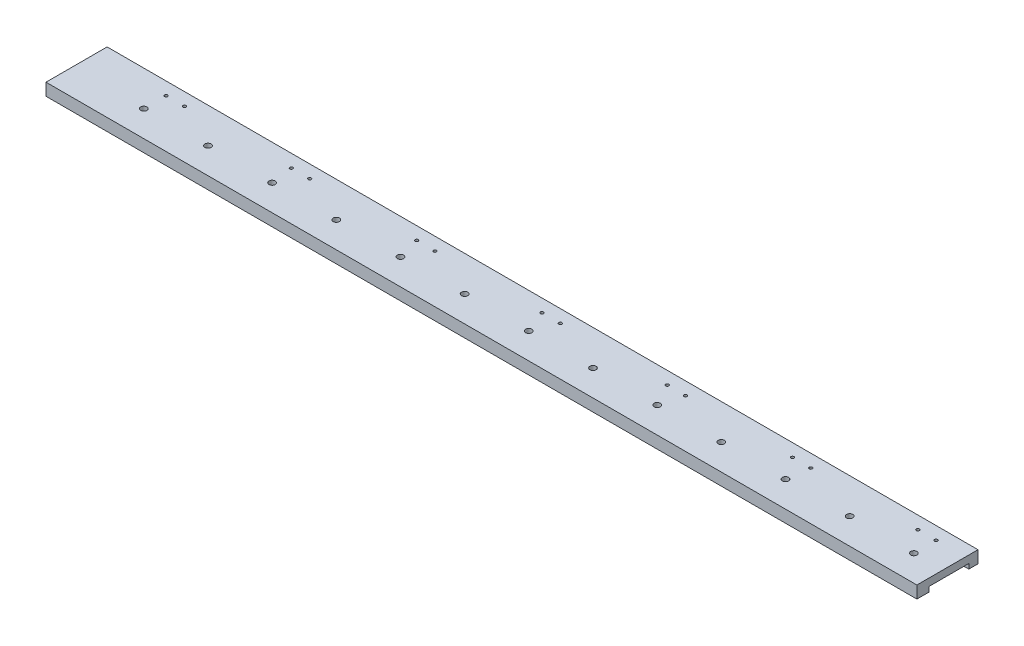
ISO-10303-21;
HEADER;
FILE_DESCRIPTION(('STEP AP214'),'2;1');
FILE_NAME('part.step','',(''),(''),'','','');
FILE_SCHEMA(('AUTOMOTIVE_DESIGN { 1 0 10303 214 1 1 1 1 }'));
ENDSEC;
DATA;
#1=APPLICATION_CONTEXT('core data for automotive mechanical design processes');
#2=APPLICATION_PROTOCOL_DEFINITION('international standard','automotive_design',2000,#1);
#3=PRODUCT_CONTEXT('',#1,'mechanical');
#4=PRODUCT('Part','Part','',(#3));
#5=PRODUCT_RELATED_PRODUCT_CATEGORY('part','',(#4));
#6=PRODUCT_DEFINITION_FORMATION('','',#4);
#7=PRODUCT_DEFINITION_CONTEXT('part definition',#1,'design');
#8=PRODUCT_DEFINITION('design','',#6,#7);
#9=PRODUCT_DEFINITION_SHAPE('','',#8);
#10=(LENGTH_UNIT() NAMED_UNIT(*) SI_UNIT(.MILLI.,.METRE.));
#11=(NAMED_UNIT(*) PLANE_ANGLE_UNIT() SI_UNIT($,.RADIAN.));
#12=(NAMED_UNIT(*) SI_UNIT($,.STERADIAN.) SOLID_ANGLE_UNIT());
#13=UNCERTAINTY_MEASURE_WITH_UNIT(LENGTH_MEASURE(1.E-05),#10,'distance_accuracy_value','');
#14=(GEOMETRIC_REPRESENTATION_CONTEXT(3) GLOBAL_UNCERTAINTY_ASSIGNED_CONTEXT((#13)) GLOBAL_UNIT_ASSIGNED_CONTEXT((#10,
#11,#12)) REPRESENTATION_CONTEXT('',''));
#15=CARTESIAN_POINT('',(0.,0.,0.));
#16=DIRECTION('',(0.,0.,1.));
#17=DIRECTION('',(1.,0.,0.));
#18=AXIS2_PLACEMENT_3D('',#15,#16,#17);
#19=CARTESIAN_POINT('',(0.,0.,0.));
#20=DIRECTION('',(0.,-1.,0.));
#21=DIRECTION('',(0.,0.,-1.));
#22=AXIS2_PLACEMENT_3D('',#19,#20,#21);
#23=PLANE('',#22);
#24=DIRECTION('',(1.,0.,0.));
#25=VECTOR('',#24,1.);
#26=CARTESIAN_POINT('',(-712.5,0.,-50.));
#27=LINE('',#26,#25);
#28=CARTESIAN_POINT('',(-712.5,0.,-50.));
#29=VERTEX_POINT('',#28);
#30=CARTESIAN_POINT('',(712.5,0.,-50.));
#31=VERTEX_POINT('',#30);
#32=EDGE_CURVE('E670',#29,#31,#27,.T.);
#33=ORIENTED_EDGE('',*,*,#32,.T.);
#34=DIRECTION('',(0.,0.,1.));
#35=VECTOR('',#34,1.);
#36=CARTESIAN_POINT('',(712.5,0.,50.));
#37=LINE('',#36,#35);
#38=CARTESIAN_POINT('',(712.5,0.,-35.));
#39=VERTEX_POINT('',#38);
#40=EDGE_CURVE('E89',#31,#39,#37,.T.);
#41=ORIENTED_EDGE('',*,*,#40,.T.);
#42=DIRECTION('',(-1.,0.,0.));
#43=VECTOR('',#42,1.);
#44=CARTESIAN_POINT('',(-712.5,0.,-35.));
#45=LINE('',#44,#43);
#46=CARTESIAN_POINT('',(-712.5,0.,-35.));
#47=VERTEX_POINT('',#46);
#48=EDGE_CURVE('E86',#39,#47,#45,.T.);
#49=ORIENTED_EDGE('',*,*,#48,.T.);
#50=DIRECTION('',(0.,0.,-1.));
#51=VECTOR('',#50,1.);
#52=CARTESIAN_POINT('',(-712.5,0.,50.));
#53=LINE('',#52,#51);
#54=EDGE_CURVE('E87',#47,#29,#53,.T.);
#55=ORIENTED_EDGE('',*,*,#54,.T.);
#56=EDGE_LOOP('',(#33,#41,#49,#55));
#57=FACE_BOUND('',#56,.T.);
#58=ADVANCED_FACE('F17',(#57),#23,.T.);
#59=CARTESIAN_POINT('',(-712.5,8.,-35.));
#60=DIRECTION('',(0.,0.,-1.));
#61=DIRECTION('',(-1.,0.,0.));
#62=AXIS2_PLACEMENT_3D('',#59,#60,#61);
#63=PLANE('',#62);
#64=DIRECTION('',(0.,1.,0.));
#65=VECTOR('',#64,1.);
#66=CARTESIAN_POINT('',(712.5,20.,-35.));
#67=LINE('',#66,#65);
#68=CARTESIAN_POINT('',(712.5,8.,-35.));
#69=VERTEX_POINT('',#68);
#70=EDGE_CURVE('E664',#39,#69,#67,.T.);
#71=ORIENTED_EDGE('',*,*,#70,.T.);
#72=DIRECTION('',(1.,0.,0.));
#73=VECTOR('',#72,1.);
#74=CARTESIAN_POINT('',(0.,8.,-35.));
#75=LINE('',#74,#73);
#76=CARTESIAN_POINT('',(-712.5,8.,-35.));
#77=VERTEX_POINT('',#76);
#78=EDGE_CURVE('E103',#69,#77,#75,.F.);
#79=ORIENTED_EDGE('',*,*,#78,.T.);
#80=DIRECTION('',(0.,1.,0.));
#81=VECTOR('',#80,1.);
#82=CARTESIAN_POINT('',(-712.5,20.,-35.));
#83=LINE('',#82,#81);
#84=EDGE_CURVE('E81',#77,#47,#83,.F.);
#85=ORIENTED_EDGE('',*,*,#84,.T.);
#86=ORIENTED_EDGE('',*,*,#48,.F.);
#87=EDGE_LOOP('',(#71,#79,#85,#86));
#88=FACE_BOUND('',#87,.T.);
#89=ADVANCED_FACE('F102',(#88),#63,.F.);
#90=CARTESIAN_POINT('',(-712.5,8.,30.));
#91=DIRECTION('',(0.,0.,1.));
#92=DIRECTION('',(1.,0.,0.));
#93=AXIS2_PLACEMENT_3D('',#90,#91,#92);
#94=PLANE('',#93);
#95=DIRECTION('',(0.,1.,0.));
#96=VECTOR('',#95,1.);
#97=CARTESIAN_POINT('',(-712.5,20.,30.));
#98=LINE('',#97,#96);
#99=CARTESIAN_POINT('',(-712.5,0.,30.));
#100=VERTEX_POINT('',#99);
#101=CARTESIAN_POINT('',(-712.5,8.,30.));
#102=VERTEX_POINT('',#101);
#103=EDGE_CURVE('E630',#100,#102,#98,.T.);
#104=ORIENTED_EDGE('',*,*,#103,.T.);
#105=DIRECTION('',(1.,0.,0.));
#106=VECTOR('',#105,1.);
#107=CARTESIAN_POINT('',(0.,8.,30.));
#108=LINE('',#107,#106);
#109=CARTESIAN_POINT('',(712.5,8.,30.));
#110=VERTEX_POINT('',#109);
#111=EDGE_CURVE('E112',#102,#110,#108,.T.);
#112=ORIENTED_EDGE('',*,*,#111,.T.);
#113=DIRECTION('',(0.,1.,0.));
#114=VECTOR('',#113,1.);
#115=CARTESIAN_POINT('',(712.5,20.,30.));
#116=LINE('',#115,#114);
#117=CARTESIAN_POINT('',(712.5,0.,30.));
#118=VERTEX_POINT('',#117);
#119=EDGE_CURVE('E659',#110,#118,#116,.F.);
#120=ORIENTED_EDGE('',*,*,#119,.T.);
#121=DIRECTION('',(1.,0.,0.));
#122=VECTOR('',#121,1.);
#123=CARTESIAN_POINT('',(0.,0.,30.));
#124=LINE('',#123,#122);
#125=EDGE_CURVE('E93',#100,#118,#124,.T.);
#126=ORIENTED_EDGE('',*,*,#125,.F.);
#127=EDGE_LOOP('',(#104,#112,#120,#126));
#128=FACE_BOUND('',#127,.T.);
#129=ADVANCED_FACE('F601',(#128),#94,.F.);
#130=CARTESIAN_POINT('',(0.,0.,0.));
#131=DIRECTION('',(0.,-1.,0.));
#132=DIRECTION('',(0.,0.,-1.));
#133=AXIS2_PLACEMENT_3D('',#130,#131,#132);
#134=PLANE('',#133);
#135=DIRECTION('',(-1.,0.,0.));
#136=VECTOR('',#135,1.);
#137=CARTESIAN_POINT('',(-712.5,0.,50.));
#138=LINE('',#137,#136);
#139=CARTESIAN_POINT('',(712.5,0.,50.));
#140=VERTEX_POINT('',#139);
#141=CARTESIAN_POINT('',(-712.5,0.,50.));
#142=VERTEX_POINT('',#141);
#143=EDGE_CURVE('E105',#140,#142,#138,.T.);
#144=ORIENTED_EDGE('',*,*,#143,.T.);
#145=DIRECTION('',(0.,0.,-1.));
#146=VECTOR('',#145,1.);
#147=CARTESIAN_POINT('',(-712.5,0.,50.));
#148=LINE('',#147,#146);
#149=EDGE_CURVE('E636',#142,#100,#148,.T.);
#150=ORIENTED_EDGE('',*,*,#149,.T.);
#151=ORIENTED_EDGE('',*,*,#125,.T.);
#152=DIRECTION('',(0.,0.,1.));
#153=VECTOR('',#152,1.);
#154=CARTESIAN_POINT('',(712.5,0.,50.));
#155=LINE('',#154,#153);
#156=EDGE_CURVE('E257',#118,#140,#155,.T.);
#157=ORIENTED_EDGE('',*,*,#156,.T.);
#158=EDGE_LOOP('',(#144,#150,#151,#157));
#159=FACE_BOUND('',#158,.T.);
#160=ADVANCED_FACE('F291',(#159),#134,.T.);
#161=CARTESIAN_POINT('',(0.,8.,0.));
#162=DIRECTION('',(0.,1.,0.));
#163=DIRECTION('',(0.,0.,1.));
#164=AXIS2_PLACEMENT_3D('',#161,#162,#163);
#165=PLANE('',#164);
#166=CARTESIAN_POINT('',(635.,8.,-29.));
#167=DIRECTION('',(0.,-1.,0.));
#168=DIRECTION('',(0.,0.,-1.));
#169=AXIS2_PLACEMENT_3D('',#166,#167,#168);
#170=CIRCLE('',#169,2.49999999999994);
#171=CARTESIAN_POINT('',(635.,8.,-31.4999999999999));
#172=VERTEX_POINT('',#171);
#173=EDGE_CURVE('E194',#172,#172,#170,.F.);
#174=ORIENTED_EDGE('',*,*,#173,.T.);
#175=EDGE_LOOP('',(#174));
#176=FACE_BOUND('',#175,.T.);
#177=CARTESIAN_POINT('',(430.,8.,-29.));
#178=DIRECTION('',(0.,-1.,0.));
#179=DIRECTION('',(0.,0.,-1.));
#180=AXIS2_PLACEMENT_3D('',#177,#178,#179);
#181=CIRCLE('',#180,2.49999999999994);
#182=CARTESIAN_POINT('',(430.,8.,-31.4999999999999));
#183=VERTEX_POINT('',#182);
#184=EDGE_CURVE('E197',#183,#183,#181,.F.);
#185=ORIENTED_EDGE('',*,*,#184,.T.);
#186=EDGE_LOOP('',(#185));
#187=FACE_BOUND('',#186,.T.);
#188=CARTESIAN_POINT('',(225.,8.,-29.));
#189=DIRECTION('',(0.,-1.,0.));
#190=DIRECTION('',(0.,0.,-1.));
#191=AXIS2_PLACEMENT_3D('',#188,#189,#190);
#192=CIRCLE('',#191,2.49999999999994);
#193=CARTESIAN_POINT('',(225.,8.,-31.4999999999999));
#194=VERTEX_POINT('',#193);
#195=EDGE_CURVE('E200',#194,#194,#192,.F.);
#196=ORIENTED_EDGE('',*,*,#195,.T.);
#197=EDGE_LOOP('',(#196));
#198=FACE_BOUND('',#197,.T.);
#199=CARTESIAN_POINT('',(20.,8.,-29.));
#200=DIRECTION('',(0.,-1.,0.));
#201=DIRECTION('',(0.,0.,-1.));
#202=AXIS2_PLACEMENT_3D('',#199,#200,#201);
#203=CIRCLE('',#202,2.49999999999994);
#204=CARTESIAN_POINT('',(20.,8.,-31.4999999999999));
#205=VERTEX_POINT('',#204);
#206=EDGE_CURVE('E203',#205,#205,#203,.F.);
#207=ORIENTED_EDGE('',*,*,#206,.T.);
#208=EDGE_LOOP('',(#207));
#209=FACE_BOUND('',#208,.T.);
#210=CARTESIAN_POINT('',(-185.,8.,-29.));
#211=DIRECTION('',(0.,-1.,0.));
#212=DIRECTION('',(0.,0.,-1.));
#213=AXIS2_PLACEMENT_3D('',#210,#211,#212);
#214=CIRCLE('',#213,2.49999999999994);
#215=CARTESIAN_POINT('',(-185.,8.,-31.4999999999999));
#216=VERTEX_POINT('',#215);
#217=EDGE_CURVE('E206',#216,#216,#214,.F.);
#218=ORIENTED_EDGE('',*,*,#217,.T.);
#219=EDGE_LOOP('',(#218));
#220=FACE_BOUND('',#219,.T.);
#221=CARTESIAN_POINT('',(665.,8.,-29.));
#222=DIRECTION('',(0.,-1.,0.));
#223=DIRECTION('',(0.,0.,-1.));
#224=AXIS2_PLACEMENT_3D('',#221,#222,#223);
#225=CIRCLE('',#224,2.49999999999994);
#226=CARTESIAN_POINT('',(665.,8.,-31.4999999999999));
#227=VERTEX_POINT('',#226);
#228=EDGE_CURVE('E209',#227,#227,#225,.F.);
#229=ORIENTED_EDGE('',*,*,#228,.T.);
#230=EDGE_LOOP('',(#229));
#231=FACE_BOUND('',#230,.T.);
#232=CARTESIAN_POINT('',(460.,8.,-29.));
#233=DIRECTION('',(0.,-1.,0.));
#234=DIRECTION('',(0.,0.,-1.));
#235=AXIS2_PLACEMENT_3D('',#232,#233,#234);
#236=CIRCLE('',#235,2.49999999999994);
#237=CARTESIAN_POINT('',(460.,8.,-31.4999999999999));
#238=VERTEX_POINT('',#237);
#239=EDGE_CURVE('E212',#238,#238,#236,.F.);
#240=ORIENTED_EDGE('',*,*,#239,.T.);
#241=EDGE_LOOP('',(#240));
#242=FACE_BOUND('',#241,.T.);
#243=CARTESIAN_POINT('',(255.,8.,-29.));
#244=DIRECTION('',(0.,-1.,0.));
#245=DIRECTION('',(0.,0.,-1.));
#246=AXIS2_PLACEMENT_3D('',#243,#244,#245);
#247=CIRCLE('',#246,2.49999999999994);
#248=CARTESIAN_POINT('',(255.,8.,-31.4999999999999));
#249=VERTEX_POINT('',#248);
#250=EDGE_CURVE('E215',#249,#249,#247,.F.);
#251=ORIENTED_EDGE('',*,*,#250,.T.);
#252=EDGE_LOOP('',(#251));
#253=FACE_BOUND('',#252,.T.);
#254=CARTESIAN_POINT('',(50.,8.,-29.));
#255=DIRECTION('',(0.,-1.,0.));
#256=DIRECTION('',(0.,0.,-1.));
#257=AXIS2_PLACEMENT_3D('',#254,#255,#256);
#258=CIRCLE('',#257,2.49999999999994);
#259=CARTESIAN_POINT('',(50.,8.,-31.4999999999999));
#260=VERTEX_POINT('',#259);
#261=EDGE_CURVE('E218',#260,#260,#258,.F.);
#262=ORIENTED_EDGE('',*,*,#261,.T.);
#263=EDGE_LOOP('',(#262));
#264=FACE_BOUND('',#263,.T.);
#265=CARTESIAN_POINT('',(-155.,8.,-29.));
#266=DIRECTION('',(0.,-1.,0.));
#267=DIRECTION('',(0.,0.,-1.));
#268=AXIS2_PLACEMENT_3D('',#265,#266,#267);
#269=CIRCLE('',#268,2.49999999999994);
#270=CARTESIAN_POINT('',(-155.,8.,-31.4999999999999));
#271=VERTEX_POINT('',#270);
#272=EDGE_CURVE('E221',#271,#271,#269,.F.);
#273=ORIENTED_EDGE('',*,*,#272,.T.);
#274=EDGE_LOOP('',(#273));
#275=FACE_BOUND('',#274,.T.);
#276=CARTESIAN_POINT('',(-595.,8.,7.5));
#277=DIRECTION('',(0.,-1.,0.));
#278=DIRECTION('',(0.,0.,-1.));
#279=AXIS2_PLACEMENT_3D('',#276,#277,#278);
#280=CIRCLE('',#279,5.1);
#281=CARTESIAN_POINT('',(-595.,8.,2.4));
#282=VERTEX_POINT('',#281);
#283=EDGE_CURVE('E224',#282,#282,#280,.F.);
#284=ORIENTED_EDGE('',*,*,#283,.T.);
#285=EDGE_LOOP('',(#284));
#286=FACE_BOUND('',#285,.T.);
#287=CARTESIAN_POINT('',(-490.,8.,7.5));
#288=DIRECTION('',(0.,-1.,0.));
#289=DIRECTION('',(0.,0.,-1.));
#290=AXIS2_PLACEMENT_3D('',#287,#288,#289);
#291=CIRCLE('',#290,5.1);
#292=CARTESIAN_POINT('',(-490.,8.,2.4));
#293=VERTEX_POINT('',#292);
#294=EDGE_CURVE('E227',#293,#293,#291,.F.);
#295=ORIENTED_EDGE('',*,*,#294,.T.);
#296=EDGE_LOOP('',(#295));
#297=FACE_BOUND('',#296,.T.);
#298=CARTESIAN_POINT('',(-385.,8.,7.5));
#299=DIRECTION('',(0.,-1.,0.));
#300=DIRECTION('',(0.,0.,-1.));
#301=AXIS2_PLACEMENT_3D('',#298,#299,#300);
#302=CIRCLE('',#301,5.1);
#303=CARTESIAN_POINT('',(-385.,8.,2.4));
#304=VERTEX_POINT('',#303);
#305=EDGE_CURVE('E230',#304,#304,#302,.F.);
#306=ORIENTED_EDGE('',*,*,#305,.T.);
#307=EDGE_LOOP('',(#306));
#308=FACE_BOUND('',#307,.T.);
#309=CARTESIAN_POINT('',(-280.,8.,7.5));
#310=DIRECTION('',(0.,-1.,0.));
#311=DIRECTION('',(0.,0.,-1.));
#312=AXIS2_PLACEMENT_3D('',#309,#310,#311);
#313=CIRCLE('',#312,5.1);
#314=CARTESIAN_POINT('',(-280.,8.,2.4));
#315=VERTEX_POINT('',#314);
#316=EDGE_CURVE('E233',#315,#315,#313,.F.);
#317=ORIENTED_EDGE('',*,*,#316,.T.);
#318=EDGE_LOOP('',(#317));
#319=FACE_BOUND('',#318,.T.);
#320=CARTESIAN_POINT('',(-175.,8.,7.5));
#321=DIRECTION('',(0.,-1.,0.));
#322=DIRECTION('',(0.,0.,-1.));
#323=AXIS2_PLACEMENT_3D('',#320,#321,#322);
#324=CIRCLE('',#323,5.1);
#325=CARTESIAN_POINT('',(-175.,8.,2.4));
#326=VERTEX_POINT('',#325);
#327=EDGE_CURVE('E236',#326,#326,#324,.F.);
#328=ORIENTED_EDGE('',*,*,#327,.T.);
#329=EDGE_LOOP('',(#328));
#330=FACE_BOUND('',#329,.T.);
#331=CARTESIAN_POINT('',(-70.,8.,7.5));
#332=DIRECTION('',(0.,-1.,0.));
#333=DIRECTION('',(0.,0.,-1.));
#334=AXIS2_PLACEMENT_3D('',#331,#332,#333);
#335=CIRCLE('',#334,5.1);
#336=CARTESIAN_POINT('',(-70.,8.,2.4));
#337=VERTEX_POINT('',#336);
#338=EDGE_CURVE('E239',#337,#337,#335,.F.);
#339=ORIENTED_EDGE('',*,*,#338,.T.);
#340=EDGE_LOOP('',(#339));
#341=FACE_BOUND('',#340,.T.);
#342=CARTESIAN_POINT('',(35.,8.,7.5));
#343=DIRECTION('',(0.,-1.,0.));
#344=DIRECTION('',(0.,0.,-1.));
#345=AXIS2_PLACEMENT_3D('',#342,#343,#344);
#346=CIRCLE('',#345,5.1);
#347=CARTESIAN_POINT('',(35.,8.,2.4));
#348=VERTEX_POINT('',#347);
#349=EDGE_CURVE('E242',#348,#348,#346,.F.);
#350=ORIENTED_EDGE('',*,*,#349,.T.);
#351=EDGE_LOOP('',(#350));
#352=FACE_BOUND('',#351,.T.);
#353=CARTESIAN_POINT('',(140.,8.,7.5));
#354=DIRECTION('',(0.,-1.,0.));
#355=DIRECTION('',(0.,0.,-1.));
#356=AXIS2_PLACEMENT_3D('',#353,#354,#355);
#357=CIRCLE('',#356,5.1);
#358=CARTESIAN_POINT('',(140.,8.,2.4));
#359=VERTEX_POINT('',#358);
#360=EDGE_CURVE('E245',#359,#359,#357,.F.);
#361=ORIENTED_EDGE('',*,*,#360,.T.);
#362=EDGE_LOOP('',(#361));
#363=FACE_BOUND('',#362,.T.);
#364=CARTESIAN_POINT('',(245.,8.,7.5));
#365=DIRECTION('',(0.,-1.,0.));
#366=DIRECTION('',(0.,0.,-1.));
#367=AXIS2_PLACEMENT_3D('',#364,#365,#366);
#368=CIRCLE('',#367,5.1);
#369=CARTESIAN_POINT('',(245.,8.,2.4));
#370=VERTEX_POINT('',#369);
#371=EDGE_CURVE('E248',#370,#370,#368,.F.);
#372=ORIENTED_EDGE('',*,*,#371,.T.);
#373=EDGE_LOOP('',(#372));
#374=FACE_BOUND('',#373,.T.);
#375=CARTESIAN_POINT('',(350.,8.,7.5));
#376=DIRECTION('',(0.,-1.,0.));
#377=DIRECTION('',(0.,0.,-1.));
#378=AXIS2_PLACEMENT_3D('',#375,#376,#377);
#379=CIRCLE('',#378,5.1);
#380=CARTESIAN_POINT('',(350.,8.,2.4));
#381=VERTEX_POINT('',#380);
#382=EDGE_CURVE('E251',#381,#381,#379,.F.);
#383=ORIENTED_EDGE('',*,*,#382,.T.);
#384=EDGE_LOOP('',(#383));
#385=FACE_BOUND('',#384,.T.);
#386=CARTESIAN_POINT('',(455.,8.,7.5));
#387=DIRECTION('',(0.,-1.,0.));
#388=DIRECTION('',(0.,0.,-1.));
#389=AXIS2_PLACEMENT_3D('',#386,#387,#388);
#390=CIRCLE('',#389,5.1);
#391=CARTESIAN_POINT('',(455.,8.,2.4));
#392=VERTEX_POINT('',#391);
#393=EDGE_CURVE('E254',#392,#392,#390,.F.);
#394=ORIENTED_EDGE('',*,*,#393,.T.);
#395=EDGE_LOOP('',(#394));
#396=FACE_BOUND('',#395,.T.);
#397=ORIENTED_EDGE('',*,*,#78,.F.);
#398=DIRECTION('',(0.,0.,1.));
#399=VECTOR('',#398,1.);
#400=CARTESIAN_POINT('',(712.5,8.,50.));
#401=LINE('',#400,#399);
#402=EDGE_CURVE('E661',#69,#110,#401,.T.);
#403=ORIENTED_EDGE('',*,*,#402,.T.);
#404=ORIENTED_EDGE('',*,*,#111,.F.);
#405=DIRECTION('',(0.,0.,-1.));
#406=VECTOR('',#405,1.);
#407=CARTESIAN_POINT('',(-712.5,8.,50.));
#408=LINE('',#407,#406);
#409=EDGE_CURVE('E635',#102,#77,#408,.T.);
#410=ORIENTED_EDGE('',*,*,#409,.T.);
#411=EDGE_LOOP('',(#397,#403,#404,#410));
#412=FACE_BOUND('',#411,.T.);
#413=CARTESIAN_POINT('',(665.,8.,7.5));
#414=DIRECTION('',(0.,-1.,0.));
#415=DIRECTION('',(0.,0.,-1.));
#416=AXIS2_PLACEMENT_3D('',#413,#414,#415);
#417=CIRCLE('',#416,5.1);
#418=CARTESIAN_POINT('',(665.,8.,2.4));
#419=VERTEX_POINT('',#418);
#420=EDGE_CURVE('E107',#419,#419,#417,.F.);
#421=ORIENTED_EDGE('',*,*,#420,.T.);
#422=EDGE_LOOP('',(#421));
#423=FACE_BOUND('',#422,.T.);
#424=CARTESIAN_POINT('',(560.,8.,7.5));
#425=DIRECTION('',(0.,-1.,0.));
#426=DIRECTION('',(0.,0.,-1.));
#427=AXIS2_PLACEMENT_3D('',#424,#425,#426);
#428=CIRCLE('',#427,5.1);
#429=CARTESIAN_POINT('',(560.,8.,2.4));
#430=VERTEX_POINT('',#429);
#431=EDGE_CURVE('E260',#430,#430,#428,.F.);
#432=ORIENTED_EDGE('',*,*,#431,.T.);
#433=EDGE_LOOP('',(#432));
#434=FACE_BOUND('',#433,.T.);
#435=CARTESIAN_POINT('',(-595.,8.,-29.));
#436=DIRECTION('',(0.,-1.,0.));
#437=DIRECTION('',(0.,0.,-1.));
#438=AXIS2_PLACEMENT_3D('',#435,#436,#437);
#439=CIRCLE('',#438,2.49999999999994);
#440=CARTESIAN_POINT('',(-595.,8.,-31.4999999999999));
#441=VERTEX_POINT('',#440);
#442=EDGE_CURVE('E263',#441,#441,#439,.F.);
#443=ORIENTED_EDGE('',*,*,#442,.T.);
#444=EDGE_LOOP('',(#443));
#445=FACE_BOUND('',#444,.T.);
#446=CARTESIAN_POINT('',(-565.,8.,-29.));
#447=DIRECTION('',(0.,-1.,0.));
#448=DIRECTION('',(0.,0.,-1.));
#449=AXIS2_PLACEMENT_3D('',#446,#447,#448);
#450=CIRCLE('',#449,2.49999999999994);
#451=CARTESIAN_POINT('',(-565.,8.,-31.4999999999999));
#452=VERTEX_POINT('',#451);
#453=EDGE_CURVE('E266',#452,#452,#450,.F.);
#454=ORIENTED_EDGE('',*,*,#453,.T.);
#455=EDGE_LOOP('',(#454));
#456=FACE_BOUND('',#455,.T.);
#457=CARTESIAN_POINT('',(-360.,8.,-29.));
#458=DIRECTION('',(0.,-1.,0.));
#459=DIRECTION('',(0.,0.,-1.));
#460=AXIS2_PLACEMENT_3D('',#457,#458,#459);
#461=CIRCLE('',#460,2.49999999999994);
#462=CARTESIAN_POINT('',(-360.,8.,-31.4999999999999));
#463=VERTEX_POINT('',#462);
#464=EDGE_CURVE('E268',#463,#463,#461,.F.);
#465=ORIENTED_EDGE('',*,*,#464,.T.);
#466=EDGE_LOOP('',(#465));
#467=FACE_BOUND('',#466,.T.);
#468=CARTESIAN_POINT('',(-390.,8.,-29.));
#469=DIRECTION('',(0.,-1.,0.));
#470=DIRECTION('',(0.,0.,-1.));
#471=AXIS2_PLACEMENT_3D('',#468,#469,#470);
#472=CIRCLE('',#471,2.49999999999994);
#473=CARTESIAN_POINT('',(-390.,8.,-31.4999999999999));
#474=VERTEX_POINT('',#473);
#475=EDGE_CURVE('E20',#474,#474,#472,.F.);
#476=ORIENTED_EDGE('',*,*,#475,.T.);
#477=EDGE_LOOP('',(#476));
#478=FACE_BOUND('',#477,.T.);
#479=ADVANCED_FACE('F275',(#176,#187,#198,#209,#220,#231,#242,#253,#264,#275,#286,#297,#308,
#319,#330,#341,#352,#363,#374,#385,#396,#412,#423,#434,#445,#456,#467,#478),#165,.F.);
#480=CARTESIAN_POINT('',(-390.,8.,-29.));
#481=DIRECTION('',(0.,-1.,0.));
#482=DIRECTION('',(0.,0.,-1.));
#483=AXIS2_PLACEMENT_3D('',#480,#481,#482);
#484=CYLINDRICAL_SURFACE('',#483,2.49999999999994);
#485=CARTESIAN_POINT('',(-390.,20.,-29.));
#486=DIRECTION('',(0.,-1.,0.));
#487=DIRECTION('',(0.,0.,-1.));
#488=AXIS2_PLACEMENT_3D('',#485,#486,#487);
#489=CIRCLE('',#488,2.49999999999994);
#490=CARTESIAN_POINT('',(-390.,20.,-31.4999999999999));
#491=VERTEX_POINT('',#490);
#492=EDGE_CURVE('E191',#491,#491,#489,.F.);
#493=ORIENTED_EDGE('',*,*,#492,.T.);
#494=EDGE_LOOP('',(#493));
#495=FACE_BOUND('',#494,.T.);
#496=ORIENTED_EDGE('',*,*,#475,.F.);
#497=EDGE_LOOP('',(#496));
#498=FACE_BOUND('',#497,.T.);
#499=ADVANCED_FACE('F277',(#495,#498),#484,.F.);
#500=CARTESIAN_POINT('',(-360.,8.,-29.));
#501=DIRECTION('',(0.,-1.,0.));
#502=DIRECTION('',(0.,0.,-1.));
#503=AXIS2_PLACEMENT_3D('',#500,#501,#502);
#504=CYLINDRICAL_SURFACE('',#503,2.49999999999994);
#505=CARTESIAN_POINT('',(-360.,20.,-29.));
#506=DIRECTION('',(0.,-1.,0.));
#507=DIRECTION('',(0.,0.,-1.));
#508=AXIS2_PLACEMENT_3D('',#505,#506,#507);
#509=CIRCLE('',#508,2.49999999999994);
#510=CARTESIAN_POINT('',(-360.,20.,-31.4999999999999));
#511=VERTEX_POINT('',#510);
#512=EDGE_CURVE('E188',#511,#511,#509,.F.);
#513=ORIENTED_EDGE('',*,*,#512,.T.);
#514=EDGE_LOOP('',(#513));
#515=FACE_BOUND('',#514,.T.);
#516=ORIENTED_EDGE('',*,*,#464,.F.);
#517=EDGE_LOOP('',(#516));
#518=FACE_BOUND('',#517,.T.);
#519=ADVANCED_FACE('F279',(#515,#518),#504,.F.);
#520=CARTESIAN_POINT('',(-565.,8.,-29.));
#521=DIRECTION('',(0.,-1.,0.));
#522=DIRECTION('',(0.,0.,-1.));
#523=AXIS2_PLACEMENT_3D('',#520,#521,#522);
#524=CYLINDRICAL_SURFACE('',#523,2.49999999999994);
#525=CARTESIAN_POINT('',(-565.,20.,-29.));
#526=DIRECTION('',(0.,-1.,0.));
#527=DIRECTION('',(0.,0.,-1.));
#528=AXIS2_PLACEMENT_3D('',#525,#526,#527);
#529=CIRCLE('',#528,2.49999999999994);
#530=CARTESIAN_POINT('',(-565.,20.,-31.4999999999999));
#531=VERTEX_POINT('',#530);
#532=EDGE_CURVE('E185',#531,#531,#529,.F.);
#533=ORIENTED_EDGE('',*,*,#532,.T.);
#534=EDGE_LOOP('',(#533));
#535=FACE_BOUND('',#534,.T.);
#536=ORIENTED_EDGE('',*,*,#453,.F.);
#537=EDGE_LOOP('',(#536));
#538=FACE_BOUND('',#537,.T.);
#539=ADVANCED_FACE('F288',(#535,#538),#524,.F.);
#540=CARTESIAN_POINT('',(-595.,8.,-29.));
#541=DIRECTION('',(0.,-1.,0.));
#542=DIRECTION('',(0.,0.,-1.));
#543=AXIS2_PLACEMENT_3D('',#540,#541,#542);
#544=CYLINDRICAL_SURFACE('',#543,2.49999999999994);
#545=CARTESIAN_POINT('',(-595.,20.,-29.));
#546=DIRECTION('',(0.,-1.,0.));
#547=DIRECTION('',(0.,0.,-1.));
#548=AXIS2_PLACEMENT_3D('',#545,#546,#547);
#549=CIRCLE('',#548,2.49999999999994);
#550=CARTESIAN_POINT('',(-595.,20.,-31.4999999999999));
#551=VERTEX_POINT('',#550);
#552=EDGE_CURVE('E182',#551,#551,#549,.F.);
#553=ORIENTED_EDGE('',*,*,#552,.T.);
#554=EDGE_LOOP('',(#553));
#555=FACE_BOUND('',#554,.T.);
#556=ORIENTED_EDGE('',*,*,#442,.F.);
#557=EDGE_LOOP('',(#556));
#558=FACE_BOUND('',#557,.T.);
#559=ADVANCED_FACE('F408',(#555,#558),#544,.F.);
#560=CARTESIAN_POINT('',(560.,8.,7.5));
#561=DIRECTION('',(0.,-1.,0.));
#562=DIRECTION('',(0.,0.,-1.));
#563=AXIS2_PLACEMENT_3D('',#560,#561,#562);
#564=CYLINDRICAL_SURFACE('',#563,5.1);
#565=CARTESIAN_POINT('',(560.,20.,7.5));
#566=DIRECTION('',(0.,-1.,0.));
#567=DIRECTION('',(0.,0.,-1.));
#568=AXIS2_PLACEMENT_3D('',#565,#566,#567);
#569=CIRCLE('',#568,5.1);
#570=CARTESIAN_POINT('',(560.,20.,2.4));
#571=VERTEX_POINT('',#570);
#572=EDGE_CURVE('E179',#571,#571,#569,.F.);
#573=ORIENTED_EDGE('',*,*,#572,.T.);
#574=EDGE_LOOP('',(#573));
#575=FACE_BOUND('',#574,.T.);
#576=ORIENTED_EDGE('',*,*,#431,.F.);
#577=EDGE_LOOP('',(#576));
#578=FACE_BOUND('',#577,.T.);
#579=ADVANCED_FACE('F404',(#575,#578),#564,.F.);
#580=CARTESIAN_POINT('',(665.,8.,7.5));
#581=DIRECTION('',(0.,-1.,0.));
#582=DIRECTION('',(0.,0.,-1.));
#583=AXIS2_PLACEMENT_3D('',#580,#581,#582);
#584=CYLINDRICAL_SURFACE('',#583,5.1);
#585=CARTESIAN_POINT('',(665.,20.,7.5));
#586=DIRECTION('',(0.,-1.,0.));
#587=DIRECTION('',(0.,0.,-1.));
#588=AXIS2_PLACEMENT_3D('',#585,#586,#587);
#589=CIRCLE('',#588,5.1);
#590=CARTESIAN_POINT('',(665.,20.,2.4));
#591=VERTEX_POINT('',#590);
#592=EDGE_CURVE('E175',#591,#591,#589,.F.);
#593=ORIENTED_EDGE('',*,*,#592,.T.);
#594=EDGE_LOOP('',(#593));
#595=FACE_BOUND('',#594,.T.);
#596=ORIENTED_EDGE('',*,*,#420,.F.);
#597=EDGE_LOOP('',(#596));
#598=FACE_BOUND('',#597,.T.);
#599=ADVANCED_FACE('F400',(#595,#598),#584,.F.);
#600=CARTESIAN_POINT('',(-712.5,20.,50.));
#601=DIRECTION('',(0.,0.,-1.));
#602=DIRECTION('',(-1.,0.,0.));
#603=AXIS2_PLACEMENT_3D('',#600,#601,#602);
#604=PLANE('',#603);
#605=DIRECTION('',(0.,1.,0.));
#606=VECTOR('',#605,1.);
#607=CARTESIAN_POINT('',(712.5,20.,50.));
#608=LINE('',#607,#606);
#609=CARTESIAN_POINT('',(712.5,20.,50.));
#610=VERTEX_POINT('',#609);
#611=EDGE_CURVE('E668',#140,#610,#608,.T.);
#612=ORIENTED_EDGE('',*,*,#611,.T.);
#613=DIRECTION('',(1.,0.,0.));
#614=VECTOR('',#613,1.);
#615=CARTESIAN_POINT('',(0.,20.,50.));
#616=LINE('',#615,#614);
#617=CARTESIAN_POINT('',(-712.5,20.,50.));
#618=VERTEX_POINT('',#617);
#619=EDGE_CURVE('E178',#610,#618,#616,.F.);
#620=ORIENTED_EDGE('',*,*,#619,.T.);
#621=DIRECTION('',(0.,1.,0.));
#622=VECTOR('',#621,1.);
#623=CARTESIAN_POINT('',(-712.5,20.,50.));
#624=LINE('',#623,#622);
#625=EDGE_CURVE('E100',#618,#142,#624,.F.);
#626=ORIENTED_EDGE('',*,*,#625,.T.);
#627=ORIENTED_EDGE('',*,*,#143,.F.);
#628=EDGE_LOOP('',(#612,#620,#626,#627));
#629=FACE_BOUND('',#628,.T.);
#630=ADVANCED_FACE('F397',(#629),#604,.F.);
#631=CARTESIAN_POINT('',(-712.5,20.,50.));
#632=DIRECTION('',(1.,0.,0.));
#633=DIRECTION('',(0.,0.,-1.));
#634=AXIS2_PLACEMENT_3D('',#631,#632,#633);
#635=PLANE('',#634);
#636=ORIENTED_EDGE('',*,*,#103,.F.);
#637=ORIENTED_EDGE('',*,*,#149,.F.);
#638=ORIENTED_EDGE('',*,*,#625,.F.);
#639=DIRECTION('',(0.,0.,-1.));
#640=VECTOR('',#639,1.);
#641=CARTESIAN_POINT('',(-712.5,20.,0.));
#642=LINE('',#641,#640);
#643=CARTESIAN_POINT('',(-712.5,20.,-50.));
#644=VERTEX_POINT('',#643);
#645=EDGE_CURVE('E646',#618,#644,#642,.T.);
#646=ORIENTED_EDGE('',*,*,#645,.T.);
#647=DIRECTION('',(0.,1.,0.));
#648=VECTOR('',#647,1.);
#649=CARTESIAN_POINT('',(-712.5,20.,-50.));
#650=LINE('',#649,#648);
#651=EDGE_CURVE('E99',#644,#29,#650,.F.);
#652=ORIENTED_EDGE('',*,*,#651,.T.);
#653=ORIENTED_EDGE('',*,*,#54,.F.);
#654=ORIENTED_EDGE('',*,*,#84,.F.);
#655=ORIENTED_EDGE('',*,*,#409,.F.);
#656=EDGE_LOOP('',(#636,#637,#638,#646,#652,#653,#654,#655));
#657=FACE_BOUND('',#656,.T.);
#658=ADVANCED_FACE('F97',(#657),#635,.F.);
#659=CARTESIAN_POINT('',(-712.5,20.,-50.));
#660=DIRECTION('',(0.,0.,1.));
#661=DIRECTION('',(1.,0.,0.));
#662=AXIS2_PLACEMENT_3D('',#659,#660,#661);
#663=PLANE('',#662);
#664=ORIENTED_EDGE('',*,*,#651,.F.);
#665=DIRECTION('',(1.,0.,0.));
#666=VECTOR('',#665,1.);
#667=CARTESIAN_POINT('',(0.,20.,-50.));
#668=LINE('',#667,#666);
#669=CARTESIAN_POINT('',(712.5,20.,-50.));
#670=VERTEX_POINT('',#669);
#671=EDGE_CURVE('E651',#644,#670,#668,.T.);
#672=ORIENTED_EDGE('',*,*,#671,.T.);
#673=DIRECTION('',(0.,1.,0.));
#674=VECTOR('',#673,1.);
#675=CARTESIAN_POINT('',(712.5,20.,-50.));
#676=LINE('',#675,#674);
#677=EDGE_CURVE('E35',#670,#31,#676,.F.);
#678=ORIENTED_EDGE('',*,*,#677,.T.);
#679=ORIENTED_EDGE('',*,*,#32,.F.);
#680=EDGE_LOOP('',(#664,#672,#678,#679));
#681=FACE_BOUND('',#680,.T.);
#682=ADVANCED_FACE('F391',(#681),#663,.F.);
#683=CARTESIAN_POINT('',(712.5,20.,50.));
#684=DIRECTION('',(-1.,0.,0.));
#685=DIRECTION('',(0.,0.,1.));
#686=AXIS2_PLACEMENT_3D('',#683,#684,#685);
#687=PLANE('',#686);
#688=ORIENTED_EDGE('',*,*,#119,.F.);
#689=ORIENTED_EDGE('',*,*,#402,.F.);
#690=ORIENTED_EDGE('',*,*,#70,.F.);
#691=ORIENTED_EDGE('',*,*,#40,.F.);
#692=ORIENTED_EDGE('',*,*,#677,.F.);
#693=DIRECTION('',(0.,0.,-1.));
#694=VECTOR('',#693,1.);
#695=CARTESIAN_POINT('',(712.5,20.,0.));
#696=LINE('',#695,#694);
#697=EDGE_CURVE('E174',#670,#610,#696,.F.);
#698=ORIENTED_EDGE('',*,*,#697,.T.);
#699=ORIENTED_EDGE('',*,*,#611,.F.);
#700=ORIENTED_EDGE('',*,*,#156,.F.);
#701=EDGE_LOOP('',(#688,#689,#690,#691,#692,#698,#699,#700));
#702=FACE_BOUND('',#701,.T.);
#703=ADVANCED_FACE('F387',(#702),#687,.F.);
#704=CARTESIAN_POINT('',(455.,8.,7.5));
#705=DIRECTION('',(0.,-1.,0.));
#706=DIRECTION('',(0.,0.,-1.));
#707=AXIS2_PLACEMENT_3D('',#704,#705,#706);
#708=CYLINDRICAL_SURFACE('',#707,5.1);
#709=CARTESIAN_POINT('',(455.,20.,7.5));
#710=DIRECTION('',(0.,-1.,0.));
#711=DIRECTION('',(0.,0.,-1.));
#712=AXIS2_PLACEMENT_3D('',#709,#710,#711);
#713=CIRCLE('',#712,5.1);
#714=CARTESIAN_POINT('',(455.,20.,2.4));
#715=VERTEX_POINT('',#714);
#716=EDGE_CURVE('E171',#715,#715,#713,.F.);
#717=ORIENTED_EDGE('',*,*,#716,.T.);
#718=EDGE_LOOP('',(#717));
#719=FACE_BOUND('',#718,.T.);
#720=ORIENTED_EDGE('',*,*,#393,.F.);
#721=EDGE_LOOP('',(#720));
#722=FACE_BOUND('',#721,.T.);
#723=ADVANCED_FACE('F383',(#719,#722),#708,.F.);
#724=CARTESIAN_POINT('',(350.,8.,7.5));
#725=DIRECTION('',(0.,-1.,0.));
#726=DIRECTION('',(0.,0.,-1.));
#727=AXIS2_PLACEMENT_3D('',#724,#725,#726);
#728=CYLINDRICAL_SURFACE('',#727,5.1);
#729=CARTESIAN_POINT('',(350.,20.,7.5));
#730=DIRECTION('',(0.,-1.,0.));
#731=DIRECTION('',(0.,0.,-1.));
#732=AXIS2_PLACEMENT_3D('',#729,#730,#731);
#733=CIRCLE('',#732,5.1);
#734=CARTESIAN_POINT('',(350.,20.,2.4));
#735=VERTEX_POINT('',#734);
#736=EDGE_CURVE('E168',#735,#735,#733,.F.);
#737=ORIENTED_EDGE('',*,*,#736,.T.);
#738=EDGE_LOOP('',(#737));
#739=FACE_BOUND('',#738,.T.);
#740=ORIENTED_EDGE('',*,*,#382,.F.);
#741=EDGE_LOOP('',(#740));
#742=FACE_BOUND('',#741,.T.);
#743=ADVANCED_FACE('F379',(#739,#742),#728,.F.);
#744=CARTESIAN_POINT('',(245.,8.,7.5));
#745=DIRECTION('',(0.,-1.,0.));
#746=DIRECTION('',(0.,0.,-1.));
#747=AXIS2_PLACEMENT_3D('',#744,#745,#746);
#748=CYLINDRICAL_SURFACE('',#747,5.1);
#749=CARTESIAN_POINT('',(245.,20.,7.5));
#750=DIRECTION('',(0.,-1.,0.));
#751=DIRECTION('',(0.,0.,-1.));
#752=AXIS2_PLACEMENT_3D('',#749,#750,#751);
#753=CIRCLE('',#752,5.1);
#754=CARTESIAN_POINT('',(245.,20.,2.4));
#755=VERTEX_POINT('',#754);
#756=EDGE_CURVE('E165',#755,#755,#753,.F.);
#757=ORIENTED_EDGE('',*,*,#756,.T.);
#758=EDGE_LOOP('',(#757));
#759=FACE_BOUND('',#758,.T.);
#760=ORIENTED_EDGE('',*,*,#371,.F.);
#761=EDGE_LOOP('',(#760));
#762=FACE_BOUND('',#761,.T.);
#763=ADVANCED_FACE('F375',(#759,#762),#748,.F.);
#764=CARTESIAN_POINT('',(140.,8.,7.5));
#765=DIRECTION('',(0.,-1.,0.));
#766=DIRECTION('',(0.,0.,-1.));
#767=AXIS2_PLACEMENT_3D('',#764,#765,#766);
#768=CYLINDRICAL_SURFACE('',#767,5.1);
#769=CARTESIAN_POINT('',(140.,20.,7.5));
#770=DIRECTION('',(0.,-1.,0.));
#771=DIRECTION('',(0.,0.,-1.));
#772=AXIS2_PLACEMENT_3D('',#769,#770,#771);
#773=CIRCLE('',#772,5.1);
#774=CARTESIAN_POINT('',(140.,20.,2.4));
#775=VERTEX_POINT('',#774);
#776=EDGE_CURVE('E162',#775,#775,#773,.F.);
#777=ORIENTED_EDGE('',*,*,#776,.T.);
#778=EDGE_LOOP('',(#777));
#779=FACE_BOUND('',#778,.T.);
#780=ORIENTED_EDGE('',*,*,#360,.F.);
#781=EDGE_LOOP('',(#780));
#782=FACE_BOUND('',#781,.T.);
#783=ADVANCED_FACE('F371',(#779,#782),#768,.F.);
#784=CARTESIAN_POINT('',(35.,8.,7.5));
#785=DIRECTION('',(0.,-1.,0.));
#786=DIRECTION('',(0.,0.,-1.));
#787=AXIS2_PLACEMENT_3D('',#784,#785,#786);
#788=CYLINDRICAL_SURFACE('',#787,5.1);
#789=CARTESIAN_POINT('',(35.,20.,7.5));
#790=DIRECTION('',(0.,-1.,0.));
#791=DIRECTION('',(0.,0.,-1.));
#792=AXIS2_PLACEMENT_3D('',#789,#790,#791);
#793=CIRCLE('',#792,5.1);
#794=CARTESIAN_POINT('',(35.,20.,2.4));
#795=VERTEX_POINT('',#794);
#796=EDGE_CURVE('E159',#795,#795,#793,.F.);
#797=ORIENTED_EDGE('',*,*,#796,.T.);
#798=EDGE_LOOP('',(#797));
#799=FACE_BOUND('',#798,.T.);
#800=ORIENTED_EDGE('',*,*,#349,.F.);
#801=EDGE_LOOP('',(#800));
#802=FACE_BOUND('',#801,.T.);
#803=ADVANCED_FACE('F367',(#799,#802),#788,.F.);
#804=CARTESIAN_POINT('',(-70.,8.,7.5));
#805=DIRECTION('',(0.,-1.,0.));
#806=DIRECTION('',(0.,0.,-1.));
#807=AXIS2_PLACEMENT_3D('',#804,#805,#806);
#808=CYLINDRICAL_SURFACE('',#807,5.1);
#809=CARTESIAN_POINT('',(-70.,20.,7.5));
#810=DIRECTION('',(0.,-1.,0.));
#811=DIRECTION('',(0.,0.,-1.));
#812=AXIS2_PLACEMENT_3D('',#809,#810,#811);
#813=CIRCLE('',#812,5.1);
#814=CARTESIAN_POINT('',(-70.,20.,2.4));
#815=VERTEX_POINT('',#814);
#816=EDGE_CURVE('E156',#815,#815,#813,.F.);
#817=ORIENTED_EDGE('',*,*,#816,.T.);
#818=EDGE_LOOP('',(#817));
#819=FACE_BOUND('',#818,.T.);
#820=ORIENTED_EDGE('',*,*,#338,.F.);
#821=EDGE_LOOP('',(#820));
#822=FACE_BOUND('',#821,.T.);
#823=ADVANCED_FACE('F363',(#819,#822),#808,.F.);
#824=CARTESIAN_POINT('',(-175.,8.,7.5));
#825=DIRECTION('',(0.,-1.,0.));
#826=DIRECTION('',(0.,0.,-1.));
#827=AXIS2_PLACEMENT_3D('',#824,#825,#826);
#828=CYLINDRICAL_SURFACE('',#827,5.1);
#829=CARTESIAN_POINT('',(-175.,20.,7.5));
#830=DIRECTION('',(0.,-1.,0.));
#831=DIRECTION('',(0.,0.,-1.));
#832=AXIS2_PLACEMENT_3D('',#829,#830,#831);
#833=CIRCLE('',#832,5.1);
#834=CARTESIAN_POINT('',(-175.,20.,2.4));
#835=VERTEX_POINT('',#834);
#836=EDGE_CURVE('E153',#835,#835,#833,.F.);
#837=ORIENTED_EDGE('',*,*,#836,.T.);
#838=EDGE_LOOP('',(#837));
#839=FACE_BOUND('',#838,.T.);
#840=ORIENTED_EDGE('',*,*,#327,.F.);
#841=EDGE_LOOP('',(#840));
#842=FACE_BOUND('',#841,.T.);
#843=ADVANCED_FACE('F359',(#839,#842),#828,.F.);
#844=CARTESIAN_POINT('',(-280.,8.,7.5));
#845=DIRECTION('',(0.,-1.,0.));
#846=DIRECTION('',(0.,0.,-1.));
#847=AXIS2_PLACEMENT_3D('',#844,#845,#846);
#848=CYLINDRICAL_SURFACE('',#847,5.1);
#849=CARTESIAN_POINT('',(-280.,20.,7.5));
#850=DIRECTION('',(0.,-1.,0.));
#851=DIRECTION('',(0.,0.,-1.));
#852=AXIS2_PLACEMENT_3D('',#849,#850,#851);
#853=CIRCLE('',#852,5.1);
#854=CARTESIAN_POINT('',(-280.,20.,2.4));
#855=VERTEX_POINT('',#854);
#856=EDGE_CURVE('E150',#855,#855,#853,.F.);
#857=ORIENTED_EDGE('',*,*,#856,.T.);
#858=EDGE_LOOP('',(#857));
#859=FACE_BOUND('',#858,.T.);
#860=ORIENTED_EDGE('',*,*,#316,.F.);
#861=EDGE_LOOP('',(#860));
#862=FACE_BOUND('',#861,.T.);
#863=ADVANCED_FACE('F355',(#859,#862),#848,.F.);
#864=CARTESIAN_POINT('',(-385.,8.,7.5));
#865=DIRECTION('',(0.,-1.,0.));
#866=DIRECTION('',(0.,0.,-1.));
#867=AXIS2_PLACEMENT_3D('',#864,#865,#866);
#868=CYLINDRICAL_SURFACE('',#867,5.1);
#869=CARTESIAN_POINT('',(-385.,20.,7.5));
#870=DIRECTION('',(0.,-1.,0.));
#871=DIRECTION('',(0.,0.,-1.));
#872=AXIS2_PLACEMENT_3D('',#869,#870,#871);
#873=CIRCLE('',#872,5.1);
#874=CARTESIAN_POINT('',(-385.,20.,2.4));
#875=VERTEX_POINT('',#874);
#876=EDGE_CURVE('E147',#875,#875,#873,.F.);
#877=ORIENTED_EDGE('',*,*,#876,.T.);
#878=EDGE_LOOP('',(#877));
#879=FACE_BOUND('',#878,.T.);
#880=ORIENTED_EDGE('',*,*,#305,.F.);
#881=EDGE_LOOP('',(#880));
#882=FACE_BOUND('',#881,.T.);
#883=ADVANCED_FACE('F351',(#879,#882),#868,.F.);
#884=CARTESIAN_POINT('',(-490.,8.,7.5));
#885=DIRECTION('',(0.,-1.,0.));
#886=DIRECTION('',(0.,0.,-1.));
#887=AXIS2_PLACEMENT_3D('',#884,#885,#886);
#888=CYLINDRICAL_SURFACE('',#887,5.1);
#889=CARTESIAN_POINT('',(-490.,20.,7.5));
#890=DIRECTION('',(0.,-1.,0.));
#891=DIRECTION('',(0.,0.,-1.));
#892=AXIS2_PLACEMENT_3D('',#889,#890,#891);
#893=CIRCLE('',#892,5.1);
#894=CARTESIAN_POINT('',(-490.,20.,2.4));
#895=VERTEX_POINT('',#894);
#896=EDGE_CURVE('E144',#895,#895,#893,.F.);
#897=ORIENTED_EDGE('',*,*,#896,.T.);
#898=EDGE_LOOP('',(#897));
#899=FACE_BOUND('',#898,.T.);
#900=ORIENTED_EDGE('',*,*,#294,.F.);
#901=EDGE_LOOP('',(#900));
#902=FACE_BOUND('',#901,.T.);
#903=ADVANCED_FACE('F347',(#899,#902),#888,.F.);
#904=CARTESIAN_POINT('',(-595.,8.,7.5));
#905=DIRECTION('',(0.,-1.,0.));
#906=DIRECTION('',(0.,0.,-1.));
#907=AXIS2_PLACEMENT_3D('',#904,#905,#906);
#908=CYLINDRICAL_SURFACE('',#907,5.1);
#909=CARTESIAN_POINT('',(-595.,20.,7.5));
#910=DIRECTION('',(0.,-1.,0.));
#911=DIRECTION('',(0.,0.,-1.));
#912=AXIS2_PLACEMENT_3D('',#909,#910,#911);
#913=CIRCLE('',#912,5.1);
#914=CARTESIAN_POINT('',(-595.,20.,2.4));
#915=VERTEX_POINT('',#914);
#916=EDGE_CURVE('E141',#915,#915,#913,.F.);
#917=ORIENTED_EDGE('',*,*,#916,.T.);
#918=EDGE_LOOP('',(#917));
#919=FACE_BOUND('',#918,.T.);
#920=ORIENTED_EDGE('',*,*,#283,.F.);
#921=EDGE_LOOP('',(#920));
#922=FACE_BOUND('',#921,.T.);
#923=ADVANCED_FACE('F343',(#919,#922),#908,.F.);
#924=CARTESIAN_POINT('',(-155.,8.,-29.));
#925=DIRECTION('',(0.,-1.,0.));
#926=DIRECTION('',(0.,0.,-1.));
#927=AXIS2_PLACEMENT_3D('',#924,#925,#926);
#928=CYLINDRICAL_SURFACE('',#927,2.49999999999994);
#929=CARTESIAN_POINT('',(-155.,20.,-29.));
#930=DIRECTION('',(0.,-1.,0.));
#931=DIRECTION('',(0.,0.,-1.));
#932=AXIS2_PLACEMENT_3D('',#929,#930,#931);
#933=CIRCLE('',#932,2.49999999999994);
#934=CARTESIAN_POINT('',(-155.,20.,-31.4999999999999));
#935=VERTEX_POINT('',#934);
#936=EDGE_CURVE('E138',#935,#935,#933,.F.);
#937=ORIENTED_EDGE('',*,*,#936,.T.);
#938=EDGE_LOOP('',(#937));
#939=FACE_BOUND('',#938,.T.);
#940=ORIENTED_EDGE('',*,*,#272,.F.);
#941=EDGE_LOOP('',(#940));
#942=FACE_BOUND('',#941,.T.);
#943=ADVANCED_FACE('F339',(#939,#942),#928,.F.);
#944=CARTESIAN_POINT('',(50.,8.,-29.));
#945=DIRECTION('',(0.,-1.,0.));
#946=DIRECTION('',(0.,0.,-1.));
#947=AXIS2_PLACEMENT_3D('',#944,#945,#946);
#948=CYLINDRICAL_SURFACE('',#947,2.49999999999994);
#949=CARTESIAN_POINT('',(50.,20.,-29.));
#950=DIRECTION('',(0.,-1.,0.));
#951=DIRECTION('',(0.,0.,-1.));
#952=AXIS2_PLACEMENT_3D('',#949,#950,#951);
#953=CIRCLE('',#952,2.49999999999994);
#954=CARTESIAN_POINT('',(50.,20.,-31.4999999999999));
#955=VERTEX_POINT('',#954);
#956=EDGE_CURVE('E135',#955,#955,#953,.F.);
#957=ORIENTED_EDGE('',*,*,#956,.T.);
#958=EDGE_LOOP('',(#957));
#959=FACE_BOUND('',#958,.T.);
#960=ORIENTED_EDGE('',*,*,#261,.F.);
#961=EDGE_LOOP('',(#960));
#962=FACE_BOUND('',#961,.T.);
#963=ADVANCED_FACE('F335',(#959,#962),#948,.F.);
#964=CARTESIAN_POINT('',(255.,8.,-29.));
#965=DIRECTION('',(0.,-1.,0.));
#966=DIRECTION('',(0.,0.,-1.));
#967=AXIS2_PLACEMENT_3D('',#964,#965,#966);
#968=CYLINDRICAL_SURFACE('',#967,2.49999999999994);
#969=CARTESIAN_POINT('',(255.,20.,-29.));
#970=DIRECTION('',(0.,-1.,0.));
#971=DIRECTION('',(0.,0.,-1.));
#972=AXIS2_PLACEMENT_3D('',#969,#970,#971);
#973=CIRCLE('',#972,2.49999999999994);
#974=CARTESIAN_POINT('',(255.,20.,-31.4999999999999));
#975=VERTEX_POINT('',#974);
#976=EDGE_CURVE('E132',#975,#975,#973,.F.);
#977=ORIENTED_EDGE('',*,*,#976,.T.);
#978=EDGE_LOOP('',(#977));
#979=FACE_BOUND('',#978,.T.);
#980=ORIENTED_EDGE('',*,*,#250,.F.);
#981=EDGE_LOOP('',(#980));
#982=FACE_BOUND('',#981,.T.);
#983=ADVANCED_FACE('F331',(#979,#982),#968,.F.);
#984=CARTESIAN_POINT('',(460.,8.,-29.));
#985=DIRECTION('',(0.,-1.,0.));
#986=DIRECTION('',(0.,0.,-1.));
#987=AXIS2_PLACEMENT_3D('',#984,#985,#986);
#988=CYLINDRICAL_SURFACE('',#987,2.49999999999994);
#989=CARTESIAN_POINT('',(460.,20.,-29.));
#990=DIRECTION('',(0.,-1.,0.));
#991=DIRECTION('',(0.,0.,-1.));
#992=AXIS2_PLACEMENT_3D('',#989,#990,#991);
#993=CIRCLE('',#992,2.49999999999994);
#994=CARTESIAN_POINT('',(460.,20.,-31.4999999999999));
#995=VERTEX_POINT('',#994);
#996=EDGE_CURVE('E129',#995,#995,#993,.F.);
#997=ORIENTED_EDGE('',*,*,#996,.T.);
#998=EDGE_LOOP('',(#997));
#999=FACE_BOUND('',#998,.T.);
#1000=ORIENTED_EDGE('',*,*,#239,.F.);
#1001=EDGE_LOOP('',(#1000));
#1002=FACE_BOUND('',#1001,.T.);
#1003=ADVANCED_FACE('F327',(#999,#1002),#988,.F.);
#1004=CARTESIAN_POINT('',(665.,8.,-29.));
#1005=DIRECTION('',(0.,-1.,0.));
#1006=DIRECTION('',(0.,0.,-1.));
#1007=AXIS2_PLACEMENT_3D('',#1004,#1005,#1006);
#1008=CYLINDRICAL_SURFACE('',#1007,2.49999999999994);
#1009=CARTESIAN_POINT('',(665.,20.,-29.));
#1010=DIRECTION('',(0.,-1.,0.));
#1011=DIRECTION('',(0.,0.,-1.));
#1012=AXIS2_PLACEMENT_3D('',#1009,#1010,#1011);
#1013=CIRCLE('',#1012,2.49999999999994);
#1014=CARTESIAN_POINT('',(665.,20.,-31.4999999999999));
#1015=VERTEX_POINT('',#1014);
#1016=EDGE_CURVE('E126',#1015,#1015,#1013,.F.);
#1017=ORIENTED_EDGE('',*,*,#1016,.T.);
#1018=EDGE_LOOP('',(#1017));
#1019=FACE_BOUND('',#1018,.T.);
#1020=ORIENTED_EDGE('',*,*,#228,.F.);
#1021=EDGE_LOOP('',(#1020));
#1022=FACE_BOUND('',#1021,.T.);
#1023=ADVANCED_FACE('F323',(#1019,#1022),#1008,.F.);
#1024=CARTESIAN_POINT('',(-185.,8.,-29.));
#1025=DIRECTION('',(0.,-1.,0.));
#1026=DIRECTION('',(0.,0.,-1.));
#1027=AXIS2_PLACEMENT_3D('',#1024,#1025,#1026);
#1028=CYLINDRICAL_SURFACE('',#1027,2.49999999999994);
#1029=CARTESIAN_POINT('',(-185.,20.,-29.));
#1030=DIRECTION('',(0.,-1.,0.));
#1031=DIRECTION('',(0.,0.,-1.));
#1032=AXIS2_PLACEMENT_3D('',#1029,#1030,#1031);
#1033=CIRCLE('',#1032,2.49999999999994);
#1034=CARTESIAN_POINT('',(-185.,20.,-31.4999999999999));
#1035=VERTEX_POINT('',#1034);
#1036=EDGE_CURVE('E123',#1035,#1035,#1033,.F.);
#1037=ORIENTED_EDGE('',*,*,#1036,.T.);
#1038=EDGE_LOOP('',(#1037));
#1039=FACE_BOUND('',#1038,.T.);
#1040=ORIENTED_EDGE('',*,*,#217,.F.);
#1041=EDGE_LOOP('',(#1040));
#1042=FACE_BOUND('',#1041,.T.);
#1043=ADVANCED_FACE('F319',(#1039,#1042),#1028,.F.);
#1044=CARTESIAN_POINT('',(20.,8.,-29.));
#1045=DIRECTION('',(0.,-1.,0.));
#1046=DIRECTION('',(0.,0.,-1.));
#1047=AXIS2_PLACEMENT_3D('',#1044,#1045,#1046);
#1048=CYLINDRICAL_SURFACE('',#1047,2.49999999999994);
#1049=CARTESIAN_POINT('',(20.,20.,-29.));
#1050=DIRECTION('',(0.,-1.,0.));
#1051=DIRECTION('',(0.,0.,-1.));
#1052=AXIS2_PLACEMENT_3D('',#1049,#1050,#1051);
#1053=CIRCLE('',#1052,2.49999999999994);
#1054=CARTESIAN_POINT('',(20.,20.,-31.4999999999999));
#1055=VERTEX_POINT('',#1054);
#1056=EDGE_CURVE('E120',#1055,#1055,#1053,.F.);
#1057=ORIENTED_EDGE('',*,*,#1056,.T.);
#1058=EDGE_LOOP('',(#1057));
#1059=FACE_BOUND('',#1058,.T.);
#1060=ORIENTED_EDGE('',*,*,#206,.F.);
#1061=EDGE_LOOP('',(#1060));
#1062=FACE_BOUND('',#1061,.T.);
#1063=ADVANCED_FACE('F315',(#1059,#1062),#1048,.F.);
#1064=CARTESIAN_POINT('',(225.,8.,-29.));
#1065=DIRECTION('',(0.,-1.,0.));
#1066=DIRECTION('',(0.,0.,-1.));
#1067=AXIS2_PLACEMENT_3D('',#1064,#1065,#1066);
#1068=CYLINDRICAL_SURFACE('',#1067,2.49999999999994);
#1069=CARTESIAN_POINT('',(225.,20.,-29.));
#1070=DIRECTION('',(0.,-1.,0.));
#1071=DIRECTION('',(0.,0.,-1.));
#1072=AXIS2_PLACEMENT_3D('',#1069,#1070,#1071);
#1073=CIRCLE('',#1072,2.49999999999994);
#1074=CARTESIAN_POINT('',(225.,20.,-31.4999999999999));
#1075=VERTEX_POINT('',#1074);
#1076=EDGE_CURVE('E117',#1075,#1075,#1073,.F.);
#1077=ORIENTED_EDGE('',*,*,#1076,.T.);
#1078=EDGE_LOOP('',(#1077));
#1079=FACE_BOUND('',#1078,.T.);
#1080=ORIENTED_EDGE('',*,*,#195,.F.);
#1081=EDGE_LOOP('',(#1080));
#1082=FACE_BOUND('',#1081,.T.);
#1083=ADVANCED_FACE('F311',(#1079,#1082),#1068,.F.);
#1084=CARTESIAN_POINT('',(430.,8.,-29.));
#1085=DIRECTION('',(0.,-1.,0.));
#1086=DIRECTION('',(0.,0.,-1.));
#1087=AXIS2_PLACEMENT_3D('',#1084,#1085,#1086);
#1088=CYLINDRICAL_SURFACE('',#1087,2.49999999999994);
#1089=CARTESIAN_POINT('',(430.,20.,-29.));
#1090=DIRECTION('',(0.,-1.,0.));
#1091=DIRECTION('',(0.,0.,-1.));
#1092=AXIS2_PLACEMENT_3D('',#1089,#1090,#1091);
#1093=CIRCLE('',#1092,2.49999999999994);
#1094=CARTESIAN_POINT('',(430.,20.,-31.4999999999999));
#1095=VERTEX_POINT('',#1094);
#1096=EDGE_CURVE('E26',#1095,#1095,#1093,.F.);
#1097=ORIENTED_EDGE('',*,*,#1096,.T.);
#1098=EDGE_LOOP('',(#1097));
#1099=FACE_BOUND('',#1098,.T.);
#1100=ORIENTED_EDGE('',*,*,#184,.F.);
#1101=EDGE_LOOP('',(#1100));
#1102=FACE_BOUND('',#1101,.T.);
#1103=ADVANCED_FACE('F303',(#1099,#1102),#1088,.F.);
#1104=CARTESIAN_POINT('',(635.,8.,-29.));
#1105=DIRECTION('',(0.,-1.,0.));
#1106=DIRECTION('',(0.,0.,-1.));
#1107=AXIS2_PLACEMENT_3D('',#1104,#1105,#1106);
#1108=CYLINDRICAL_SURFACE('',#1107,2.49999999999994);
#1109=CARTESIAN_POINT('',(635.,20.,-29.));
#1110=DIRECTION('',(0.,-1.,0.));
#1111=DIRECTION('',(0.,0.,-1.));
#1112=AXIS2_PLACEMENT_3D('',#1109,#1110,#1111);
#1113=CIRCLE('',#1112,2.49999999999994);
#1114=CARTESIAN_POINT('',(635.,20.,-31.4999999999999));
#1115=VERTEX_POINT('',#1114);
#1116=EDGE_CURVE('E11',#1115,#1115,#1113,.F.);
#1117=ORIENTED_EDGE('',*,*,#1116,.T.);
#1118=EDGE_LOOP('',(#1117));
#1119=FACE_BOUND('',#1118,.T.);
#1120=ORIENTED_EDGE('',*,*,#173,.F.);
#1121=EDGE_LOOP('',(#1120));
#1122=FACE_BOUND('',#1121,.T.);
#1123=ADVANCED_FACE('F296',(#1119,#1122),#1108,.F.);
#1124=CARTESIAN_POINT('',(0.,20.,0.));
#1125=DIRECTION('',(0.,-1.,0.));
#1126=DIRECTION('',(0.,0.,-1.));
#1127=AXIS2_PLACEMENT_3D('',#1124,#1125,#1126);
#1128=PLANE('',#1127);
#1129=ORIENTED_EDGE('',*,*,#1116,.F.);
#1130=EDGE_LOOP('',(#1129));
#1131=FACE_BOUND('',#1130,.T.);
#1132=ORIENTED_EDGE('',*,*,#1096,.F.);
#1133=EDGE_LOOP('',(#1132));
#1134=FACE_BOUND('',#1133,.T.);
#1135=ORIENTED_EDGE('',*,*,#1076,.F.);
#1136=EDGE_LOOP('',(#1135));
#1137=FACE_BOUND('',#1136,.T.);
#1138=ORIENTED_EDGE('',*,*,#1056,.F.);
#1139=EDGE_LOOP('',(#1138));
#1140=FACE_BOUND('',#1139,.T.);
#1141=ORIENTED_EDGE('',*,*,#1036,.F.);
#1142=EDGE_LOOP('',(#1141));
#1143=FACE_BOUND('',#1142,.T.);
#1144=ORIENTED_EDGE('',*,*,#1016,.F.);
#1145=EDGE_LOOP('',(#1144));
#1146=FACE_BOUND('',#1145,.T.);
#1147=ORIENTED_EDGE('',*,*,#996,.F.);
#1148=EDGE_LOOP('',(#1147));
#1149=FACE_BOUND('',#1148,.T.);
#1150=ORIENTED_EDGE('',*,*,#976,.F.);
#1151=EDGE_LOOP('',(#1150));
#1152=FACE_BOUND('',#1151,.T.);
#1153=ORIENTED_EDGE('',*,*,#956,.F.);
#1154=EDGE_LOOP('',(#1153));
#1155=FACE_BOUND('',#1154,.T.);
#1156=ORIENTED_EDGE('',*,*,#936,.F.);
#1157=EDGE_LOOP('',(#1156));
#1158=FACE_BOUND('',#1157,.T.);
#1159=ORIENTED_EDGE('',*,*,#916,.F.);
#1160=EDGE_LOOP('',(#1159));
#1161=FACE_BOUND('',#1160,.T.);
#1162=ORIENTED_EDGE('',*,*,#896,.F.);
#1163=EDGE_LOOP('',(#1162));
#1164=FACE_BOUND('',#1163,.T.);
#1165=ORIENTED_EDGE('',*,*,#876,.F.);
#1166=EDGE_LOOP('',(#1165));
#1167=FACE_BOUND('',#1166,.T.);
#1168=ORIENTED_EDGE('',*,*,#856,.F.);
#1169=EDGE_LOOP('',(#1168));
#1170=FACE_BOUND('',#1169,.T.);
#1171=ORIENTED_EDGE('',*,*,#836,.F.);
#1172=EDGE_LOOP('',(#1171));
#1173=FACE_BOUND('',#1172,.T.);
#1174=ORIENTED_EDGE('',*,*,#816,.F.);
#1175=EDGE_LOOP('',(#1174));
#1176=FACE_BOUND('',#1175,.T.);
#1177=ORIENTED_EDGE('',*,*,#796,.F.);
#1178=EDGE_LOOP('',(#1177));
#1179=FACE_BOUND('',#1178,.T.);
#1180=ORIENTED_EDGE('',*,*,#776,.F.);
#1181=EDGE_LOOP('',(#1180));
#1182=FACE_BOUND('',#1181,.T.);
#1183=ORIENTED_EDGE('',*,*,#756,.F.);
#1184=EDGE_LOOP('',(#1183));
#1185=FACE_BOUND('',#1184,.T.);
#1186=ORIENTED_EDGE('',*,*,#736,.F.);
#1187=EDGE_LOOP('',(#1186));
#1188=FACE_BOUND('',#1187,.T.);
#1189=ORIENTED_EDGE('',*,*,#716,.F.);
#1190=EDGE_LOOP('',(#1189));
#1191=FACE_BOUND('',#1190,.T.);
#1192=ORIENTED_EDGE('',*,*,#671,.F.);
#1193=ORIENTED_EDGE('',*,*,#645,.F.);
#1194=ORIENTED_EDGE('',*,*,#619,.F.);
#1195=ORIENTED_EDGE('',*,*,#697,.F.);
#1196=EDGE_LOOP('',(#1192,#1193,#1194,#1195));
#1197=FACE_BOUND('',#1196,.T.);
#1198=ORIENTED_EDGE('',*,*,#592,.F.);
#1199=EDGE_LOOP('',(#1198));
#1200=FACE_BOUND('',#1199,.T.);
#1201=ORIENTED_EDGE('',*,*,#572,.F.);
#1202=EDGE_LOOP('',(#1201));
#1203=FACE_BOUND('',#1202,.T.);
#1204=ORIENTED_EDGE('',*,*,#552,.F.);
#1205=EDGE_LOOP('',(#1204));
#1206=FACE_BOUND('',#1205,.T.);
#1207=ORIENTED_EDGE('',*,*,#532,.F.);
#1208=EDGE_LOOP('',(#1207));
#1209=FACE_BOUND('',#1208,.T.);
#1210=ORIENTED_EDGE('',*,*,#512,.F.);
#1211=EDGE_LOOP('',(#1210));
#1212=FACE_BOUND('',#1211,.T.);
#1213=ORIENTED_EDGE('',*,*,#492,.F.);
#1214=EDGE_LOOP('',(#1213));
#1215=FACE_BOUND('',#1214,.T.);
#1216=ADVANCED_FACE('F294',(#1131,#1134,#1137,#1140,#1143,#1146,#1149,#1152,#1155,#1158,#1161,
#1164,#1167,#1170,#1173,#1176,#1179,#1182,#1185,#1188,#1191,#1197,#1200,#1203,#1206,#1209,#1212,
#1215),#1128,.F.);
#1217=CLOSED_SHELL('',(#58,#89,#129,#160,#479,#499,#519,#539,#559,#579,#599,#630,#658,#682,#703,
#723,#743,#763,#783,#803,#823,#843,#863,#883,#903,#923,#943,#963,#983,#1003,#1023,#1043,#1063,
#1083,#1103,#1123,#1216));
#1218=MANIFOLD_SOLID_BREP('B1',#1217);
#1219=ADVANCED_BREP_SHAPE_REPRESENTATION('',(#18,#1218),#14);
#1220=SHAPE_DEFINITION_REPRESENTATION(#9,#1219);
ENDSEC;
END-ISO-10303-21;
